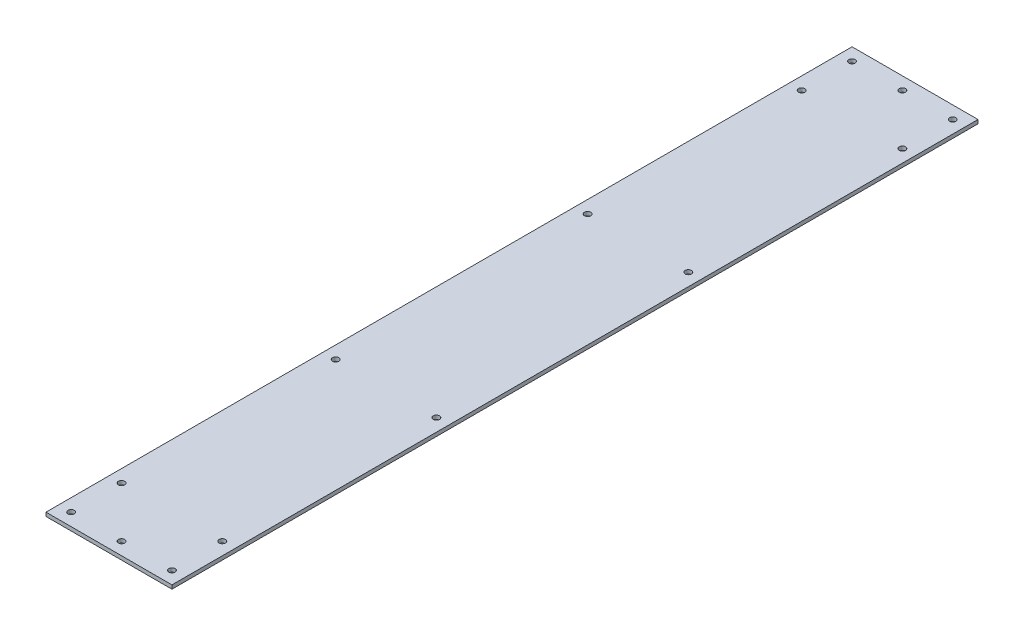
ISO-10303-21;
HEADER;
FILE_DESCRIPTION(('STEP AP214'),'2;1');
FILE_NAME('part.step','',(''),(''),'','','');
FILE_SCHEMA(('AUTOMOTIVE_DESIGN { 1 0 10303 214 1 1 1 1 }'));
ENDSEC;
DATA;
#1=APPLICATION_CONTEXT('core data for automotive mechanical design processes');
#2=APPLICATION_PROTOCOL_DEFINITION('international standard','automotive_design',2000,#1);
#3=PRODUCT_CONTEXT('',#1,'mechanical');
#4=PRODUCT('Part','Part','',(#3));
#5=PRODUCT_RELATED_PRODUCT_CATEGORY('part','',(#4));
#6=PRODUCT_DEFINITION_FORMATION('','',#4);
#7=PRODUCT_DEFINITION_CONTEXT('part definition',#1,'design');
#8=PRODUCT_DEFINITION('design','',#6,#7);
#9=PRODUCT_DEFINITION_SHAPE('','',#8);
#10=(LENGTH_UNIT() NAMED_UNIT(*) SI_UNIT(.MILLI.,.METRE.));
#11=(NAMED_UNIT(*) PLANE_ANGLE_UNIT() SI_UNIT($,.RADIAN.));
#12=(NAMED_UNIT(*) SI_UNIT($,.STERADIAN.) SOLID_ANGLE_UNIT());
#13=UNCERTAINTY_MEASURE_WITH_UNIT(LENGTH_MEASURE(1.E-05),#10,'distance_accuracy_value','');
#14=(GEOMETRIC_REPRESENTATION_CONTEXT(3) GLOBAL_UNCERTAINTY_ASSIGNED_CONTEXT((#13)) GLOBAL_UNIT_ASSIGNED_CONTEXT((#10,
#11,#12)) REPRESENTATION_CONTEXT('',''));
#15=CARTESIAN_POINT('',(0.,0.,0.));
#16=DIRECTION('',(0.,0.,1.));
#17=DIRECTION('',(1.,0.,0.));
#18=AXIS2_PLACEMENT_3D('',#15,#16,#17);
#19=CARTESIAN_POINT('',(0.,-3.,0.));
#20=DIRECTION('',(0.,-1.,0.));
#21=DIRECTION('',(1.,0.,0.));
#22=AXIS2_PLACEMENT_3D('',#19,#20,#21);
#23=PLANE('',#22);
#24=CARTESIAN_POINT('',(22.8925619834711,-3.,70.9917355371901));
#25=DIRECTION('',(0.,-1.,0.));
#26=DIRECTION('',(0.,0.,-1.));
#27=AXIS2_PLACEMENT_3D('',#24,#25,#26);
#28=CIRCLE('',#27,2.5);
#29=CARTESIAN_POINT('',(22.8925619834711,-3.,68.4917355371901));
#30=VERTEX_POINT('',#29);
#31=EDGE_CURVE('E11',#30,#30,#28,.T.);
#32=ORIENTED_EDGE('',*,*,#31,.F.);
#33=EDGE_LOOP('',(#32));
#34=FACE_BOUND('',#33,.T.);
#35=CARTESIAN_POINT('',(-17.1074380165289,-3.,30.9917355371901));
#36=DIRECTION('',(0.,-1.,0.));
#37=DIRECTION('',(0.,0.,-1.));
#38=AXIS2_PLACEMENT_3D('',#35,#36,#37);
#39=CIRCLE('',#38,2.5);
#40=CARTESIAN_POINT('',(-17.1074380165289,-3.,28.4917355371901));
#41=VERTEX_POINT('',#40);
#42=EDGE_CURVE('E23',#41,#41,#39,.T.);
#43=ORIENTED_EDGE('',*,*,#42,.F.);
#44=EDGE_LOOP('',(#43));
#45=FACE_BOUND('',#44,.T.);
#46=CARTESIAN_POINT('',(62.8925619834713,-3.,-509.00826446281));
#47=DIRECTION('',(0.,1.,0.));
#48=DIRECTION('',(0.,0.,-1.));
#49=AXIS2_PLACEMENT_3D('',#46,#47,#48);
#50=CIRCLE('',#49,2.5);
#51=CARTESIAN_POINT('',(62.8925619834713,-3.,-511.50826446281));
#52=VERTEX_POINT('',#51);
#53=EDGE_CURVE('E163',#52,#52,#50,.T.);
#54=ORIENTED_EDGE('',*,*,#53,.T.);
#55=EDGE_LOOP('',(#54));
#56=FACE_BOUND('',#55,.T.);
#57=CARTESIAN_POINT('',(22.8925619834712,-3.,-549.00826446281));
#58=DIRECTION('',(0.,-1.,0.));
#59=DIRECTION('',(0.,0.,-1.));
#60=AXIS2_PLACEMENT_3D('',#57,#58,#59);
#61=CIRCLE('',#60,2.49999999999994);
#62=CARTESIAN_POINT('',(22.8925619834712,-3.,-551.50826446281));
#63=VERTEX_POINT('',#62);
#64=EDGE_CURVE('E160',#63,#63,#61,.T.);
#65=ORIENTED_EDGE('',*,*,#64,.F.);
#66=EDGE_LOOP('',(#65));
#67=FACE_BOUND('',#66,.T.);
#68=CARTESIAN_POINT('',(-17.1074380165289,-3.,-509.00826446281));
#69=DIRECTION('',(0.,-1.,0.));
#70=DIRECTION('',(0.,0.,-1.));
#71=AXIS2_PLACEMENT_3D('',#68,#69,#70);
#72=CIRCLE('',#71,2.5);
#73=CARTESIAN_POINT('',(-17.1074380165289,-3.,-511.50826446281));
#74=VERTEX_POINT('',#73);
#75=EDGE_CURVE('E157',#74,#74,#72,.T.);
#76=ORIENTED_EDGE('',*,*,#75,.F.);
#77=EDGE_LOOP('',(#76));
#78=FACE_BOUND('',#77,.T.);
#79=CARTESIAN_POINT('',(62.8925619834712,-3.,-139.00826446281));
#80=DIRECTION('',(0.,1.,0.));
#81=DIRECTION('',(0.,0.,-1.));
#82=AXIS2_PLACEMENT_3D('',#79,#80,#81);
#83=CIRCLE('',#82,2.5);
#84=CARTESIAN_POINT('',(62.8925619834712,-3.,-141.50826446281));
#85=VERTEX_POINT('',#84);
#86=EDGE_CURVE('E154',#85,#85,#83,.T.);
#87=ORIENTED_EDGE('',*,*,#86,.T.);
#88=EDGE_LOOP('',(#87));
#89=FACE_BOUND('',#88,.T.);
#90=CARTESIAN_POINT('',(62.8925619834712,-3.,70.9917355371901));
#91=DIRECTION('',(0.,1.,0.));
#92=DIRECTION('',(0.,0.,-1.));
#93=AXIS2_PLACEMENT_3D('',#90,#91,#92);
#94=CIRCLE('',#93,2.5);
#95=CARTESIAN_POINT('',(62.8925619834712,-3.,68.4917355371901));
#96=VERTEX_POINT('',#95);
#97=EDGE_CURVE('E151',#96,#96,#94,.T.);
#98=ORIENTED_EDGE('',*,*,#97,.T.);
#99=EDGE_LOOP('',(#98));
#100=FACE_BOUND('',#99,.T.);
#101=CARTESIAN_POINT('',(-17.1074380165289,-3.,70.9917355371901));
#102=DIRECTION('',(0.,-1.,0.));
#103=DIRECTION('',(1.,0.,0.));
#104=AXIS2_PLACEMENT_3D('',#101,#102,#103);
#105=CIRCLE('',#104,2.5);
#106=CARTESIAN_POINT('',(-14.6074380165289,-3.,70.9917355371901));
#107=VERTEX_POINT('',#106);
#108=EDGE_CURVE('E148',#107,#107,#105,.T.);
#109=ORIENTED_EDGE('',*,*,#108,.F.);
#110=EDGE_LOOP('',(#109));
#111=FACE_BOUND('',#110,.T.);
#112=CARTESIAN_POINT('',(-17.1074380165289,-3.,-339.00826446281));
#113=DIRECTION('',(0.,-1.,0.));
#114=DIRECTION('',(1.,0.,0.));
#115=AXIS2_PLACEMENT_3D('',#112,#113,#114);
#116=CIRCLE('',#115,2.5);
#117=CARTESIAN_POINT('',(-14.6074380165289,-3.,-339.00826446281));
#118=VERTEX_POINT('',#117);
#119=EDGE_CURVE('E145',#118,#118,#116,.T.);
#120=ORIENTED_EDGE('',*,*,#119,.F.);
#121=EDGE_LOOP('',(#120));
#122=FACE_BOUND('',#121,.T.);
#123=CARTESIAN_POINT('',(-17.1074380165289,-3.,-549.00826446281));
#124=DIRECTION('',(0.,-1.,0.));
#125=DIRECTION('',(1.,0.,0.));
#126=AXIS2_PLACEMENT_3D('',#123,#124,#125);
#127=CIRCLE('',#126,2.5);
#128=CARTESIAN_POINT('',(-14.6074380165289,-3.,-549.00826446281));
#129=VERTEX_POINT('',#128);
#130=EDGE_CURVE('E142',#129,#129,#127,.T.);
#131=ORIENTED_EDGE('',*,*,#130,.F.);
#132=EDGE_LOOP('',(#131));
#133=FACE_BOUND('',#132,.T.);
#134=CARTESIAN_POINT('',(-17.1074380165289,-3.,-139.00826446281));
#135=DIRECTION('',(0.,-1.,0.));
#136=DIRECTION('',(1.,0.,0.));
#137=AXIS2_PLACEMENT_3D('',#134,#135,#136);
#138=CIRCLE('',#137,2.5);
#139=CARTESIAN_POINT('',(-14.6074380165289,-3.,-139.00826446281));
#140=VERTEX_POINT('',#139);
#141=EDGE_CURVE('E139',#140,#140,#138,.T.);
#142=ORIENTED_EDGE('',*,*,#141,.F.);
#143=EDGE_LOOP('',(#142));
#144=FACE_BOUND('',#143,.T.);
#145=DIRECTION('',(0.,0.,-1.));
#146=VECTOR('',#145,1.);
#147=CARTESIAN_POINT('',(-27.1074380165289,-3.,80.9917355371901));
#148=LINE('',#147,#146);
#149=CARTESIAN_POINT('',(-27.1074380165289,-3.,80.9917355371901));
#150=VERTEX_POINT('',#149);
#151=CARTESIAN_POINT('',(-27.1074380165288,-3.,-559.00826446281));
#152=VERTEX_POINT('',#151);
#153=EDGE_CURVE('E30',#150,#152,#148,.T.);
#154=ORIENTED_EDGE('',*,*,#153,.T.);
#155=DIRECTION('',(1.,0.,0.));
#156=VECTOR('',#155,1.);
#157=CARTESIAN_POINT('',(-27.1074380165288,-3.,-559.00826446281));
#158=LINE('',#157,#156);
#159=CARTESIAN_POINT('',(72.8925619834712,-3.,-559.00826446281));
#160=VERTEX_POINT('',#159);
#161=EDGE_CURVE('E35',#152,#160,#158,.T.);
#162=ORIENTED_EDGE('',*,*,#161,.T.);
#163=DIRECTION('',(0.,0.,1.));
#164=VECTOR('',#163,1.);
#165=CARTESIAN_POINT('',(72.8925619834711,-3.,80.9917355371901));
#166=LINE('',#165,#164);
#167=CARTESIAN_POINT('',(72.8925619834711,-3.,80.9917355371901));
#168=VERTEX_POINT('',#167);
#169=EDGE_CURVE('E135',#160,#168,#166,.T.);
#170=ORIENTED_EDGE('',*,*,#169,.T.);
#171=DIRECTION('',(-1.,0.,0.));
#172=VECTOR('',#171,1.);
#173=CARTESIAN_POINT('',(-27.1074380165289,-3.,80.9917355371901));
#174=LINE('',#173,#172);
#175=EDGE_CURVE('E133',#168,#150,#174,.T.);
#176=ORIENTED_EDGE('',*,*,#175,.T.);
#177=EDGE_LOOP('',(#154,#162,#170,#176));
#178=FACE_BOUND('',#177,.T.);
#179=CARTESIAN_POINT('',(62.8925619834712,-3.,-339.00826446281));
#180=DIRECTION('',(0.,-1.,0.));
#181=DIRECTION('',(0.,0.,-1.));
#182=AXIS2_PLACEMENT_3D('',#179,#180,#181);
#183=CIRCLE('',#182,2.5);
#184=CARTESIAN_POINT('',(62.8925619834712,-3.,-341.50826446281));
#185=VERTEX_POINT('',#184);
#186=EDGE_CURVE('E130',#185,#185,#183,.T.);
#187=ORIENTED_EDGE('',*,*,#186,.F.);
#188=EDGE_LOOP('',(#187));
#189=FACE_BOUND('',#188,.T.);
#190=CARTESIAN_POINT('',(62.8925619834712,-3.,-549.00826446281));
#191=DIRECTION('',(0.,-1.,0.));
#192=DIRECTION('',(0.,0.,-1.));
#193=AXIS2_PLACEMENT_3D('',#190,#191,#192);
#194=CIRCLE('',#193,2.5);
#195=CARTESIAN_POINT('',(62.8925619834712,-3.,-551.50826446281));
#196=VERTEX_POINT('',#195);
#197=EDGE_CURVE('E127',#196,#196,#194,.T.);
#198=ORIENTED_EDGE('',*,*,#197,.F.);
#199=EDGE_LOOP('',(#198));
#200=FACE_BOUND('',#199,.T.);
#201=CARTESIAN_POINT('',(62.8925619834711,-3.,30.9917355371901));
#202=DIRECTION('',(0.,1.,0.));
#203=DIRECTION('',(0.,0.,-1.));
#204=AXIS2_PLACEMENT_3D('',#201,#202,#203);
#205=CIRCLE('',#204,2.5);
#206=CARTESIAN_POINT('',(62.8925619834711,-3.,28.4917355371901));
#207=VERTEX_POINT('',#206);
#208=EDGE_CURVE('E124',#207,#207,#205,.T.);
#209=ORIENTED_EDGE('',*,*,#208,.T.);
#210=EDGE_LOOP('',(#209));
#211=FACE_BOUND('',#210,.T.);
#212=ADVANCED_FACE('F16',(#34,#45,#56,#67,#78,#89,#100,#111,#122,#133,#144,#178,#189,#200,#211),
#23,.T.);
#213=CARTESIAN_POINT('',(0.,0.,0.));
#214=DIRECTION('',(0.,-1.,0.));
#215=DIRECTION('',(1.,0.,0.));
#216=AXIS2_PLACEMENT_3D('',#213,#214,#215);
#217=PLANE('',#216);
#218=CARTESIAN_POINT('',(22.8925619834711,0.,70.9917355371901));
#219=DIRECTION('',(0.,-1.,0.));
#220=DIRECTION('',(0.,0.,-1.));
#221=AXIS2_PLACEMENT_3D('',#218,#219,#220);
#222=CIRCLE('',#221,2.5);
#223=CARTESIAN_POINT('',(22.8925619834711,0.,68.4917355371901));
#224=VERTEX_POINT('',#223);
#225=EDGE_CURVE('E121',#224,#224,#222,.T.);
#226=ORIENTED_EDGE('',*,*,#225,.T.);
#227=EDGE_LOOP('',(#226));
#228=FACE_BOUND('',#227,.T.);
#229=CARTESIAN_POINT('',(-17.1074380165289,0.,30.9917355371901));
#230=DIRECTION('',(0.,-1.,0.));
#231=DIRECTION('',(0.,0.,-1.));
#232=AXIS2_PLACEMENT_3D('',#229,#230,#231);
#233=CIRCLE('',#232,2.5);
#234=CARTESIAN_POINT('',(-17.1074380165289,0.,28.4917355371901));
#235=VERTEX_POINT('',#234);
#236=EDGE_CURVE('E118',#235,#235,#233,.T.);
#237=ORIENTED_EDGE('',*,*,#236,.T.);
#238=EDGE_LOOP('',(#237));
#239=FACE_BOUND('',#238,.T.);
#240=CARTESIAN_POINT('',(22.8925619834712,0.,-549.00826446281));
#241=DIRECTION('',(0.,-1.,0.));
#242=DIRECTION('',(0.,0.,-1.));
#243=AXIS2_PLACEMENT_3D('',#240,#241,#242);
#244=CIRCLE('',#243,2.49999999999994);
#245=CARTESIAN_POINT('',(22.8925619834712,0.,-551.50826446281));
#246=VERTEX_POINT('',#245);
#247=EDGE_CURVE('E115',#246,#246,#244,.T.);
#248=ORIENTED_EDGE('',*,*,#247,.T.);
#249=EDGE_LOOP('',(#248));
#250=FACE_BOUND('',#249,.T.);
#251=CARTESIAN_POINT('',(-17.1074380165289,0.,-509.00826446281));
#252=DIRECTION('',(0.,-1.,0.));
#253=DIRECTION('',(0.,0.,-1.));
#254=AXIS2_PLACEMENT_3D('',#251,#252,#253);
#255=CIRCLE('',#254,2.5);
#256=CARTESIAN_POINT('',(-17.1074380165289,0.,-511.50826446281));
#257=VERTEX_POINT('',#256);
#258=EDGE_CURVE('E112',#257,#257,#255,.T.);
#259=ORIENTED_EDGE('',*,*,#258,.T.);
#260=EDGE_LOOP('',(#259));
#261=FACE_BOUND('',#260,.T.);
#262=CARTESIAN_POINT('',(62.8925619834712,0.,-339.00826446281));
#263=DIRECTION('',(0.,-1.,0.));
#264=DIRECTION('',(0.,0.,-1.));
#265=AXIS2_PLACEMENT_3D('',#262,#263,#264);
#266=CIRCLE('',#265,2.5);
#267=CARTESIAN_POINT('',(62.8925619834712,0.,-341.50826446281));
#268=VERTEX_POINT('',#267);
#269=EDGE_CURVE('E109',#268,#268,#266,.T.);
#270=ORIENTED_EDGE('',*,*,#269,.T.);
#271=EDGE_LOOP('',(#270));
#272=FACE_BOUND('',#271,.T.);
#273=CARTESIAN_POINT('',(62.8925619834712,0.,-139.00826446281));
#274=DIRECTION('',(0.,-1.,0.));
#275=DIRECTION('',(0.,0.,-1.));
#276=AXIS2_PLACEMENT_3D('',#273,#274,#275);
#277=CIRCLE('',#276,2.5);
#278=CARTESIAN_POINT('',(62.8925619834712,0.,-141.50826446281));
#279=VERTEX_POINT('',#278);
#280=EDGE_CURVE('E106',#279,#279,#277,.F.);
#281=ORIENTED_EDGE('',*,*,#280,.F.);
#282=EDGE_LOOP('',(#281));
#283=FACE_BOUND('',#282,.T.);
#284=CARTESIAN_POINT('',(62.8925619834712,0.,70.9917355371901));
#285=DIRECTION('',(0.,-1.,0.));
#286=DIRECTION('',(0.,0.,-1.));
#287=AXIS2_PLACEMENT_3D('',#284,#285,#286);
#288=CIRCLE('',#287,2.5);
#289=CARTESIAN_POINT('',(62.8925619834712,0.,68.4917355371901));
#290=VERTEX_POINT('',#289);
#291=EDGE_CURVE('E103',#290,#290,#288,.F.);
#292=ORIENTED_EDGE('',*,*,#291,.F.);
#293=EDGE_LOOP('',(#292));
#294=FACE_BOUND('',#293,.T.);
#295=CARTESIAN_POINT('',(-17.1074380165289,0.,70.9917355371901));
#296=DIRECTION('',(0.,-1.,0.));
#297=DIRECTION('',(1.,0.,0.));
#298=AXIS2_PLACEMENT_3D('',#295,#296,#297);
#299=CIRCLE('',#298,2.5);
#300=CARTESIAN_POINT('',(-14.6074380165289,0.,70.9917355371901));
#301=VERTEX_POINT('',#300);
#302=EDGE_CURVE('E100',#301,#301,#299,.T.);
#303=ORIENTED_EDGE('',*,*,#302,.T.);
#304=EDGE_LOOP('',(#303));
#305=FACE_BOUND('',#304,.T.);
#306=CARTESIAN_POINT('',(-17.1074380165289,0.,-339.00826446281));
#307=DIRECTION('',(0.,-1.,0.));
#308=DIRECTION('',(1.,0.,0.));
#309=AXIS2_PLACEMENT_3D('',#306,#307,#308);
#310=CIRCLE('',#309,2.5);
#311=CARTESIAN_POINT('',(-14.6074380165289,0.,-339.00826446281));
#312=VERTEX_POINT('',#311);
#313=EDGE_CURVE('E97',#312,#312,#310,.T.);
#314=ORIENTED_EDGE('',*,*,#313,.T.);
#315=EDGE_LOOP('',(#314));
#316=FACE_BOUND('',#315,.T.);
#317=CARTESIAN_POINT('',(-17.1074380165289,0.,-549.00826446281));
#318=DIRECTION('',(0.,-1.,0.));
#319=DIRECTION('',(1.,0.,0.));
#320=AXIS2_PLACEMENT_3D('',#317,#318,#319);
#321=CIRCLE('',#320,2.5);
#322=CARTESIAN_POINT('',(-14.6074380165289,0.,-549.00826446281));
#323=VERTEX_POINT('',#322);
#324=EDGE_CURVE('E94',#323,#323,#321,.T.);
#325=ORIENTED_EDGE('',*,*,#324,.T.);
#326=EDGE_LOOP('',(#325));
#327=FACE_BOUND('',#326,.T.);
#328=CARTESIAN_POINT('',(-17.1074380165289,0.,-139.00826446281));
#329=DIRECTION('',(0.,-1.,0.));
#330=DIRECTION('',(1.,0.,0.));
#331=AXIS2_PLACEMENT_3D('',#328,#329,#330);
#332=CIRCLE('',#331,2.5);
#333=CARTESIAN_POINT('',(-14.6074380165289,0.,-139.00826446281));
#334=VERTEX_POINT('',#333);
#335=EDGE_CURVE('E73',#334,#334,#332,.T.);
#336=ORIENTED_EDGE('',*,*,#335,.T.);
#337=EDGE_LOOP('',(#336));
#338=FACE_BOUND('',#337,.T.);
#339=DIRECTION('',(0.,0.,-1.));
#340=VECTOR('',#339,1.);
#341=CARTESIAN_POINT('',(-27.1074380165289,0.,80.9917355371901));
#342=LINE('',#341,#340);
#343=CARTESIAN_POINT('',(-27.1074380165289,0.,80.9917355371901));
#344=VERTEX_POINT('',#343);
#345=CARTESIAN_POINT('',(-27.1074380165288,0.,-559.00826446281));
#346=VERTEX_POINT('',#345);
#347=EDGE_CURVE('E58',#344,#346,#342,.T.);
#348=ORIENTED_EDGE('',*,*,#347,.F.);
#349=DIRECTION('',(-1.,0.,0.));
#350=VECTOR('',#349,1.);
#351=CARTESIAN_POINT('',(-27.1074380165289,0.,80.9917355371901));
#352=LINE('',#351,#350);
#353=CARTESIAN_POINT('',(72.8925619834711,0.,80.9917355371901));
#354=VERTEX_POINT('',#353);
#355=EDGE_CURVE('E74',#354,#344,#352,.T.);
#356=ORIENTED_EDGE('',*,*,#355,.F.);
#357=DIRECTION('',(0.,0.,1.));
#358=VECTOR('',#357,1.);
#359=CARTESIAN_POINT('',(72.8925619834711,0.,80.9917355371901));
#360=LINE('',#359,#358);
#361=CARTESIAN_POINT('',(72.8925619834712,0.,-559.00826446281));
#362=VERTEX_POINT('',#361);
#363=EDGE_CURVE('E61',#362,#354,#360,.T.);
#364=ORIENTED_EDGE('',*,*,#363,.F.);
#365=DIRECTION('',(1.,0.,0.));
#366=VECTOR('',#365,1.);
#367=CARTESIAN_POINT('',(-27.1074380165288,0.,-559.00826446281));
#368=LINE('',#367,#366);
#369=EDGE_CURVE('E54',#346,#362,#368,.T.);
#370=ORIENTED_EDGE('',*,*,#369,.F.);
#371=EDGE_LOOP('',(#348,#356,#364,#370));
#372=FACE_BOUND('',#371,.T.);
#373=CARTESIAN_POINT('',(62.8925619834712,0.,-549.00826446281));
#374=DIRECTION('',(0.,-1.,0.));
#375=DIRECTION('',(0.,0.,-1.));
#376=AXIS2_PLACEMENT_3D('',#373,#374,#375);
#377=CIRCLE('',#376,2.5);
#378=CARTESIAN_POINT('',(62.8925619834712,0.,-551.50826446281));
#379=VERTEX_POINT('',#378);
#380=EDGE_CURVE('E65',#379,#379,#377,.T.);
#381=ORIENTED_EDGE('',*,*,#380,.T.);
#382=EDGE_LOOP('',(#381));
#383=FACE_BOUND('',#382,.T.);
#384=CARTESIAN_POINT('',(62.8925619834713,0.,-509.00826446281));
#385=DIRECTION('',(0.,-1.,0.));
#386=DIRECTION('',(0.,0.,-1.));
#387=AXIS2_PLACEMENT_3D('',#384,#385,#386);
#388=CIRCLE('',#387,2.5);
#389=CARTESIAN_POINT('',(62.8925619834713,0.,-511.50826446281));
#390=VERTEX_POINT('',#389);
#391=EDGE_CURVE('E80',#390,#390,#388,.F.);
#392=ORIENTED_EDGE('',*,*,#391,.F.);
#393=EDGE_LOOP('',(#392));
#394=FACE_BOUND('',#393,.T.);
#395=CARTESIAN_POINT('',(62.8925619834711,0.,30.9917355371901));
#396=DIRECTION('',(0.,-1.,0.));
#397=DIRECTION('',(0.,0.,-1.));
#398=AXIS2_PLACEMENT_3D('',#395,#396,#397);
#399=CIRCLE('',#398,2.5);
#400=CARTESIAN_POINT('',(62.8925619834711,0.,28.4917355371901));
#401=VERTEX_POINT('',#400);
#402=EDGE_CURVE('E77',#401,#401,#399,.F.);
#403=ORIENTED_EDGE('',*,*,#402,.F.);
#404=EDGE_LOOP('',(#403));
#405=FACE_BOUND('',#404,.T.);
#406=ADVANCED_FACE('F56',(#228,#239,#250,#261,#272,#283,#294,#305,#316,#327,#338,#372,#383,#394,
#405),#217,.F.);
#407=CARTESIAN_POINT('',(-27.1074380165289,-3.,80.9917355371901));
#408=DIRECTION('',(1.,0.,0.));
#409=DIRECTION('',(0.,0.,1.));
#410=AXIS2_PLACEMENT_3D('',#407,#408,#409);
#411=PLANE('',#410);
#412=ORIENTED_EDGE('',*,*,#347,.T.);
#413=DIRECTION('',(0.,1.,0.));
#414=VECTOR('',#413,1.);
#415=CARTESIAN_POINT('',(-27.1074380165288,-3.,-559.00826446281));
#416=LINE('',#415,#414);
#417=EDGE_CURVE('E69',#152,#346,#416,.T.);
#418=ORIENTED_EDGE('',*,*,#417,.F.);
#419=ORIENTED_EDGE('',*,*,#153,.F.);
#420=DIRECTION('',(0.,1.,0.));
#421=VECTOR('',#420,1.);
#422=CARTESIAN_POINT('',(-27.1074380165289,-3.,80.9917355371901));
#423=LINE('',#422,#421);
#424=EDGE_CURVE('E71',#150,#344,#423,.T.);
#425=ORIENTED_EDGE('',*,*,#424,.T.);
#426=EDGE_LOOP('',(#412,#418,#419,#425));
#427=FACE_BOUND('',#426,.T.);
#428=ADVANCED_FACE('F68',(#427),#411,.F.);
#429=CARTESIAN_POINT('',(-27.1074380165288,-3.,-559.00826446281));
#430=DIRECTION('',(0.,0.,1.));
#431=DIRECTION('',(0.,-1.,0.));
#432=AXIS2_PLACEMENT_3D('',#429,#430,#431);
#433=PLANE('',#432);
#434=ORIENTED_EDGE('',*,*,#369,.T.);
#435=DIRECTION('',(0.,1.,0.));
#436=VECTOR('',#435,1.);
#437=CARTESIAN_POINT('',(72.8925619834712,-3.,-559.00826446281));
#438=LINE('',#437,#436);
#439=EDGE_CURVE('E82',#160,#362,#438,.T.);
#440=ORIENTED_EDGE('',*,*,#439,.F.);
#441=ORIENTED_EDGE('',*,*,#161,.F.);
#442=ORIENTED_EDGE('',*,*,#417,.T.);
#443=EDGE_LOOP('',(#434,#440,#441,#442));
#444=FACE_BOUND('',#443,.T.);
#445=ADVANCED_FACE('F76',(#444),#433,.F.);
#446=CARTESIAN_POINT('',(-27.1074380165289,-3.,80.9917355371901));
#447=DIRECTION('',(0.,0.,-1.));
#448=DIRECTION('',(0.,1.,0.));
#449=AXIS2_PLACEMENT_3D('',#446,#447,#448);
#450=PLANE('',#449);
#451=ORIENTED_EDGE('',*,*,#355,.T.);
#452=ORIENTED_EDGE('',*,*,#424,.F.);
#453=ORIENTED_EDGE('',*,*,#175,.F.);
#454=DIRECTION('',(0.,1.,0.));
#455=VECTOR('',#454,1.);
#456=CARTESIAN_POINT('',(72.8925619834711,-3.,80.9917355371901));
#457=LINE('',#456,#455);
#458=EDGE_CURVE('E440',#168,#354,#457,.T.);
#459=ORIENTED_EDGE('',*,*,#458,.T.);
#460=EDGE_LOOP('',(#451,#452,#453,#459));
#461=FACE_BOUND('',#460,.T.);
#462=ADVANCED_FACE('F217',(#461),#450,.F.);
#463=CARTESIAN_POINT('',(-17.1074380165289,0.,-139.00826446281));
#464=DIRECTION('',(0.,-1.,0.));
#465=DIRECTION('',(1.,0.,0.));
#466=AXIS2_PLACEMENT_3D('',#463,#464,#465);
#467=CYLINDRICAL_SURFACE('',#466,2.5);
#468=ORIENTED_EDGE('',*,*,#335,.F.);
#469=EDGE_LOOP('',(#468));
#470=FACE_BOUND('',#469,.T.);
#471=ORIENTED_EDGE('',*,*,#141,.T.);
#472=EDGE_LOOP('',(#471));
#473=FACE_BOUND('',#472,.T.);
#474=ADVANCED_FACE('F220',(#470,#473),#467,.F.);
#475=CARTESIAN_POINT('',(-17.1074380165289,0.,-549.00826446281));
#476=DIRECTION('',(0.,-1.,0.));
#477=DIRECTION('',(1.,0.,0.));
#478=AXIS2_PLACEMENT_3D('',#475,#476,#477);
#479=CYLINDRICAL_SURFACE('',#478,2.5);
#480=ORIENTED_EDGE('',*,*,#324,.F.);
#481=EDGE_LOOP('',(#480));
#482=FACE_BOUND('',#481,.T.);
#483=ORIENTED_EDGE('',*,*,#130,.T.);
#484=EDGE_LOOP('',(#483));
#485=FACE_BOUND('',#484,.T.);
#486=ADVANCED_FACE('F224',(#482,#485),#479,.F.);
#487=CARTESIAN_POINT('',(-17.1074380165289,0.,-339.00826446281));
#488=DIRECTION('',(0.,-1.,0.));
#489=DIRECTION('',(1.,0.,0.));
#490=AXIS2_PLACEMENT_3D('',#487,#488,#489);
#491=CYLINDRICAL_SURFACE('',#490,2.5);
#492=ORIENTED_EDGE('',*,*,#313,.F.);
#493=EDGE_LOOP('',(#492));
#494=FACE_BOUND('',#493,.T.);
#495=ORIENTED_EDGE('',*,*,#119,.T.);
#496=EDGE_LOOP('',(#495));
#497=FACE_BOUND('',#496,.T.);
#498=ADVANCED_FACE('F228',(#494,#497),#491,.F.);
#499=CARTESIAN_POINT('',(-17.1074380165289,0.,70.9917355371901));
#500=DIRECTION('',(0.,-1.,0.));
#501=DIRECTION('',(1.,0.,0.));
#502=AXIS2_PLACEMENT_3D('',#499,#500,#501);
#503=CYLINDRICAL_SURFACE('',#502,2.5);
#504=ORIENTED_EDGE('',*,*,#302,.F.);
#505=EDGE_LOOP('',(#504));
#506=FACE_BOUND('',#505,.T.);
#507=ORIENTED_EDGE('',*,*,#108,.T.);
#508=EDGE_LOOP('',(#507));
#509=FACE_BOUND('',#508,.T.);
#510=ADVANCED_FACE('F232',(#506,#509),#503,.F.);
#511=CARTESIAN_POINT('',(72.8925619834711,-3.,80.9917355371901));
#512=DIRECTION('',(-1.,0.,0.));
#513=DIRECTION('',(0.,0.,-1.));
#514=AXIS2_PLACEMENT_3D('',#511,#512,#513);
#515=PLANE('',#514);
#516=ORIENTED_EDGE('',*,*,#363,.T.);
#517=ORIENTED_EDGE('',*,*,#458,.F.);
#518=ORIENTED_EDGE('',*,*,#169,.F.);
#519=ORIENTED_EDGE('',*,*,#439,.T.);
#520=EDGE_LOOP('',(#516,#517,#518,#519));
#521=FACE_BOUND('',#520,.T.);
#522=ADVANCED_FACE('F236',(#521),#515,.F.);
#523=CARTESIAN_POINT('',(62.8925619834712,22.,70.9917355371901));
#524=DIRECTION('',(0.,-1.,0.));
#525=DIRECTION('',(0.,0.,-1.));
#526=AXIS2_PLACEMENT_3D('',#523,#524,#525);
#527=CYLINDRICAL_SURFACE('',#526,2.5);
#528=ORIENTED_EDGE('',*,*,#97,.F.);
#529=EDGE_LOOP('',(#528));
#530=FACE_BOUND('',#529,.T.);
#531=ORIENTED_EDGE('',*,*,#291,.T.);
#532=EDGE_LOOP('',(#531));
#533=FACE_BOUND('',#532,.T.);
#534=ADVANCED_FACE('F240',(#530,#533),#527,.F.);
#535=CARTESIAN_POINT('',(62.8925619834712,22.,-139.00826446281));
#536=DIRECTION('',(0.,-1.,0.));
#537=DIRECTION('',(0.,0.,-1.));
#538=AXIS2_PLACEMENT_3D('',#535,#536,#537);
#539=CYLINDRICAL_SURFACE('',#538,2.5);
#540=ORIENTED_EDGE('',*,*,#86,.F.);
#541=EDGE_LOOP('',(#540));
#542=FACE_BOUND('',#541,.T.);
#543=ORIENTED_EDGE('',*,*,#280,.T.);
#544=EDGE_LOOP('',(#543));
#545=FACE_BOUND('',#544,.T.);
#546=ADVANCED_FACE('F244',(#542,#545),#539,.F.);
#547=CARTESIAN_POINT('',(62.8925619834712,22.,-339.00826446281));
#548=DIRECTION('',(0.,-1.,0.));
#549=DIRECTION('',(0.,0.,-1.));
#550=AXIS2_PLACEMENT_3D('',#547,#548,#549);
#551=CYLINDRICAL_SURFACE('',#550,2.5);
#552=ORIENTED_EDGE('',*,*,#186,.T.);
#553=EDGE_LOOP('',(#552));
#554=FACE_BOUND('',#553,.T.);
#555=ORIENTED_EDGE('',*,*,#269,.F.);
#556=EDGE_LOOP('',(#555));
#557=FACE_BOUND('',#556,.T.);
#558=ADVANCED_FACE('F248',(#554,#557),#551,.F.);
#559=CARTESIAN_POINT('',(62.8925619834712,22.,-549.00826446281));
#560=DIRECTION('',(0.,-1.,0.));
#561=DIRECTION('',(0.,0.,-1.));
#562=AXIS2_PLACEMENT_3D('',#559,#560,#561);
#563=CYLINDRICAL_SURFACE('',#562,2.5);
#564=ORIENTED_EDGE('',*,*,#197,.T.);
#565=EDGE_LOOP('',(#564));
#566=FACE_BOUND('',#565,.T.);
#567=ORIENTED_EDGE('',*,*,#380,.F.);
#568=EDGE_LOOP('',(#567));
#569=FACE_BOUND('',#568,.T.);
#570=ADVANCED_FACE('F252',(#566,#569),#563,.F.);
#571=CARTESIAN_POINT('',(-17.1074380165289,22.,-509.00826446281));
#572=DIRECTION('',(0.,-1.,0.));
#573=DIRECTION('',(0.,0.,-1.));
#574=AXIS2_PLACEMENT_3D('',#571,#572,#573);
#575=CYLINDRICAL_SURFACE('',#574,2.5);
#576=ORIENTED_EDGE('',*,*,#75,.T.);
#577=EDGE_LOOP('',(#576));
#578=FACE_BOUND('',#577,.T.);
#579=ORIENTED_EDGE('',*,*,#258,.F.);
#580=EDGE_LOOP('',(#579));
#581=FACE_BOUND('',#580,.T.);
#582=ADVANCED_FACE('F256',(#578,#581),#575,.F.);
#583=CARTESIAN_POINT('',(22.8925619834712,22.,-549.00826446281));
#584=DIRECTION('',(0.,-1.,0.));
#585=DIRECTION('',(0.,0.,-1.));
#586=AXIS2_PLACEMENT_3D('',#583,#584,#585);
#587=CYLINDRICAL_SURFACE('',#586,2.49999999999994);
#588=ORIENTED_EDGE('',*,*,#64,.T.);
#589=EDGE_LOOP('',(#588));
#590=FACE_BOUND('',#589,.T.);
#591=ORIENTED_EDGE('',*,*,#247,.F.);
#592=EDGE_LOOP('',(#591));
#593=FACE_BOUND('',#592,.T.);
#594=ADVANCED_FACE('F260',(#590,#593),#587,.F.);
#595=CARTESIAN_POINT('',(62.8925619834713,22.,-509.00826446281));
#596=DIRECTION('',(0.,-1.,0.));
#597=DIRECTION('',(0.,0.,-1.));
#598=AXIS2_PLACEMENT_3D('',#595,#596,#597);
#599=CYLINDRICAL_SURFACE('',#598,2.5);
#600=ORIENTED_EDGE('',*,*,#53,.F.);
#601=EDGE_LOOP('',(#600));
#602=FACE_BOUND('',#601,.T.);
#603=ORIENTED_EDGE('',*,*,#391,.T.);
#604=EDGE_LOOP('',(#603));
#605=FACE_BOUND('',#604,.T.);
#606=ADVANCED_FACE('F201',(#602,#605),#599,.F.);
#607=CARTESIAN_POINT('',(62.8925619834711,22.,30.9917355371901));
#608=DIRECTION('',(0.,-1.,0.));
#609=DIRECTION('',(0.,0.,-1.));
#610=AXIS2_PLACEMENT_3D('',#607,#608,#609);
#611=CYLINDRICAL_SURFACE('',#610,2.5);
#612=ORIENTED_EDGE('',*,*,#208,.F.);
#613=EDGE_LOOP('',(#612));
#614=FACE_BOUND('',#613,.T.);
#615=ORIENTED_EDGE('',*,*,#402,.T.);
#616=EDGE_LOOP('',(#615));
#617=FACE_BOUND('',#616,.T.);
#618=ADVANCED_FACE('F198',(#614,#617),#611,.F.);
#619=CARTESIAN_POINT('',(-17.1074380165289,22.,30.9917355371901));
#620=DIRECTION('',(0.,-1.,0.));
#621=DIRECTION('',(0.,0.,-1.));
#622=AXIS2_PLACEMENT_3D('',#619,#620,#621);
#623=CYLINDRICAL_SURFACE('',#622,2.5);
#624=ORIENTED_EDGE('',*,*,#42,.T.);
#625=EDGE_LOOP('',(#624));
#626=FACE_BOUND('',#625,.T.);
#627=ORIENTED_EDGE('',*,*,#236,.F.);
#628=EDGE_LOOP('',(#627));
#629=FACE_BOUND('',#628,.T.);
#630=ADVANCED_FACE('F168',(#626,#629),#623,.F.);
#631=CARTESIAN_POINT('',(22.8925619834711,22.,70.9917355371901));
#632=DIRECTION('',(0.,-1.,0.));
#633=DIRECTION('',(0.,0.,-1.));
#634=AXIS2_PLACEMENT_3D('',#631,#632,#633);
#635=CYLINDRICAL_SURFACE('',#634,2.5);
#636=ORIENTED_EDGE('',*,*,#31,.T.);
#637=EDGE_LOOP('',(#636));
#638=FACE_BOUND('',#637,.T.);
#639=ORIENTED_EDGE('',*,*,#225,.F.);
#640=EDGE_LOOP('',(#639));
#641=FACE_BOUND('',#640,.T.);
#642=ADVANCED_FACE('F270',(#638,#641),#635,.F.);
#643=CLOSED_SHELL('',(#212,#406,#428,#445,#462,#474,#486,#498,#510,#522,#534,#546,#558,#570,
#582,#594,#606,#618,#630,#642));
#644=MANIFOLD_SOLID_BREP('B1',#643);
#645=ADVANCED_BREP_SHAPE_REPRESENTATION('',(#18,#644),#14);
#646=SHAPE_DEFINITION_REPRESENTATION(#9,#645);
ENDSEC;
END-ISO-10303-21;
